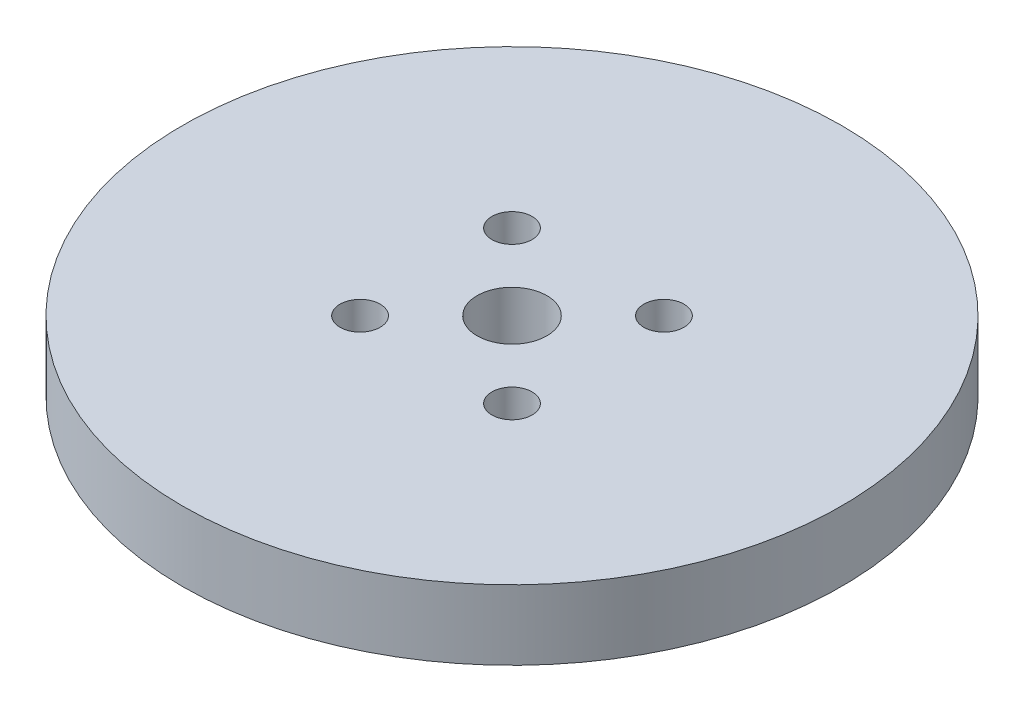
ISO-10303-21;
HEADER;
FILE_DESCRIPTION(('STEP AP214'),'2;1');
FILE_NAME('part.step','',(''),(''),'','','');
FILE_SCHEMA(('AUTOMOTIVE_DESIGN { 1 0 10303 214 1 1 1 1 }'));
ENDSEC;
DATA;
#1=APPLICATION_CONTEXT('core data for automotive mechanical design processes');
#2=APPLICATION_PROTOCOL_DEFINITION('international standard','automotive_design',2000,#1);
#3=PRODUCT_CONTEXT('',#1,'mechanical');
#4=PRODUCT('Part','Part','',(#3));
#5=PRODUCT_RELATED_PRODUCT_CATEGORY('part','',(#4));
#6=PRODUCT_DEFINITION_FORMATION('','',#4);
#7=PRODUCT_DEFINITION_CONTEXT('part definition',#1,'design');
#8=PRODUCT_DEFINITION('design','',#6,#7);
#9=PRODUCT_DEFINITION_SHAPE('','',#8);
#10=(LENGTH_UNIT() NAMED_UNIT(*) SI_UNIT(.MILLI.,.METRE.));
#11=(NAMED_UNIT(*) PLANE_ANGLE_UNIT() SI_UNIT($,.RADIAN.));
#12=(NAMED_UNIT(*) SI_UNIT($,.STERADIAN.) SOLID_ANGLE_UNIT());
#13=UNCERTAINTY_MEASURE_WITH_UNIT(LENGTH_MEASURE(1.E-05),#10,'distance_accuracy_value','');
#14=(GEOMETRIC_REPRESENTATION_CONTEXT(3) GLOBAL_UNCERTAINTY_ASSIGNED_CONTEXT((#13)) GLOBAL_UNIT_ASSIGNED_CONTEXT((#10,
#11,#12)) REPRESENTATION_CONTEXT('',''));
#15=CARTESIAN_POINT('',(0.,0.,0.));
#16=DIRECTION('',(0.,0.,1.));
#17=DIRECTION('',(1.,0.,0.));
#18=AXIS2_PLACEMENT_3D('',#15,#16,#17);
#19=CARTESIAN_POINT('',(0.,6.35,0.));
#20=DIRECTION('',(0.,-1.,0.));
#21=DIRECTION('',(0.,0.,-1.));
#22=AXIS2_PLACEMENT_3D('',#19,#20,#21);
#23=CYLINDRICAL_SURFACE('',#22,30.);
#24=CARTESIAN_POINT('',(0.,6.35,0.));
#25=DIRECTION('',(0.,1.,0.));
#26=DIRECTION('',(0.,0.,1.));
#27=AXIS2_PLACEMENT_3D('',#24,#25,#26);
#28=CIRCLE('',#27,30.);
#29=CARTESIAN_POINT('',(0.,6.35,30.));
#30=VERTEX_POINT('',#29);
#31=EDGE_CURVE('E12',#30,#30,#28,.T.);
#32=ORIENTED_EDGE('',*,*,#31,.F.);
#33=EDGE_LOOP('',(#32));
#34=FACE_BOUND('',#33,.T.);
#35=CARTESIAN_POINT('',(0.,0.,0.));
#36=DIRECTION('',(0.,1.,0.));
#37=DIRECTION('',(0.,0.,1.));
#38=AXIS2_PLACEMENT_3D('',#35,#36,#37);
#39=CIRCLE('',#38,30.);
#40=CARTESIAN_POINT('',(0.,0.,30.));
#41=VERTEX_POINT('',#40);
#42=EDGE_CURVE('E46',#41,#41,#39,.T.);
#43=ORIENTED_EDGE('',*,*,#42,.T.);
#44=EDGE_LOOP('',(#43));
#45=FACE_BOUND('',#44,.T.);
#46=ADVANCED_FACE('F43',(#34,#45),#23,.T.);
#47=CARTESIAN_POINT('',(0.,6.35,0.));
#48=DIRECTION('',(0.,1.,0.));
#49=DIRECTION('',(0.,0.,1.));
#50=AXIS2_PLACEMENT_3D('',#47,#48,#49);
#51=PLANE('',#50);
#52=CARTESIAN_POINT('',(6.91479721322342,6.35,6.914797213223));
#53=DIRECTION('',(0.,1.,0.));
#54=DIRECTION('',(1.,0.,0.));
#55=AXIS2_PLACEMENT_3D('',#52,#53,#54);
#56=CIRCLE('',#55,1.8288);
#57=CARTESIAN_POINT('',(8.74359721322342,6.35,6.914797213223));
#58=VERTEX_POINT('',#57);
#59=EDGE_CURVE('E77',#58,#58,#56,.T.);
#60=ORIENTED_EDGE('',*,*,#59,.F.);
#61=EDGE_LOOP('',(#60));
#62=FACE_BOUND('',#61,.T.);
#63=CARTESIAN_POINT('',(6.91479721322303,6.35,-6.9147972132234));
#64=DIRECTION('',(0.,1.,0.));
#65=DIRECTION('',(0.,0.,-1.));
#66=AXIS2_PLACEMENT_3D('',#63,#64,#65);
#67=CIRCLE('',#66,1.8288);
#68=CARTESIAN_POINT('',(6.91479721322303,6.35,-8.7435972132234));
#69=VERTEX_POINT('',#68);
#70=EDGE_CURVE('E70',#69,#69,#67,.T.);
#71=ORIENTED_EDGE('',*,*,#70,.F.);
#72=EDGE_LOOP('',(#71));
#73=FACE_BOUND('',#72,.T.);
#74=CARTESIAN_POINT('',(-6.91479721322347,6.35,-6.91479721322295));
#75=DIRECTION('',(0.,1.,0.));
#76=DIRECTION('',(-1.,0.,0.));
#77=AXIS2_PLACEMENT_3D('',#74,#75,#76);
#78=CIRCLE('',#77,1.8288);
#79=CARTESIAN_POINT('',(-8.74359721322347,6.35,-6.91479721322294));
#80=VERTEX_POINT('',#79);
#81=EDGE_CURVE('E71',#80,#80,#78,.T.);
#82=ORIENTED_EDGE('',*,*,#81,.F.);
#83=EDGE_LOOP('',(#82));
#84=FACE_BOUND('',#83,.T.);
#85=CARTESIAN_POINT('',(-6.91479721322303,6.35,6.9147972132234));
#86=DIRECTION('',(0.,1.,0.));
#87=DIRECTION('',(0.,0.,1.));
#88=AXIS2_PLACEMENT_3D('',#85,#86,#87);
#89=CIRCLE('',#88,1.8288);
#90=CARTESIAN_POINT('',(-6.91479721322303,6.35,8.7435972132234));
#91=VERTEX_POINT('',#90);
#92=EDGE_CURVE('E63',#91,#91,#89,.T.);
#93=ORIENTED_EDGE('',*,*,#92,.F.);
#94=EDGE_LOOP('',(#93));
#95=FACE_BOUND('',#94,.T.);
#96=CARTESIAN_POINT('',(0.,6.35,0.));
#97=DIRECTION('',(0.,1.,0.));
#98=DIRECTION('',(0.,0.,1.));
#99=AXIS2_PLACEMENT_3D('',#96,#97,#98);
#100=CIRCLE('',#99,3.175);
#101=CARTESIAN_POINT('',(0.,6.35,3.175));
#102=VERTEX_POINT('',#101);
#103=EDGE_CURVE('E57',#102,#102,#100,.T.);
#104=ORIENTED_EDGE('',*,*,#103,.F.);
#105=EDGE_LOOP('',(#104));
#106=FACE_BOUND('',#105,.T.);
#107=ORIENTED_EDGE('',*,*,#31,.T.);
#108=EDGE_LOOP('',(#107));
#109=FACE_BOUND('',#108,.T.);
#110=ADVANCED_FACE('F87',(#62,#73,#84,#95,#106,#109),#51,.T.);
#111=CARTESIAN_POINT('',(0.,0.,0.));
#112=DIRECTION('',(0.,1.,0.));
#113=DIRECTION('',(0.,0.,1.));
#114=AXIS2_PLACEMENT_3D('',#111,#112,#113);
#115=PLANE('',#114);
#116=CARTESIAN_POINT('',(6.91479721322342,0.,6.914797213223));
#117=DIRECTION('',(0.,1.,0.));
#118=DIRECTION('',(0.,0.,1.));
#119=AXIS2_PLACEMENT_3D('',#116,#117,#118);
#120=CIRCLE('',#119,1.8288);
#121=CARTESIAN_POINT('',(6.91479721322342,0.,8.743597213223));
#122=VERTEX_POINT('',#121);
#123=EDGE_CURVE('E66',#122,#122,#120,.F.);
#124=ORIENTED_EDGE('',*,*,#123,.F.);
#125=EDGE_LOOP('',(#124));
#126=FACE_BOUND('',#125,.T.);
#127=CARTESIAN_POINT('',(6.91479721322303,0.,-6.9147972132234));
#128=DIRECTION('',(0.,1.,0.));
#129=DIRECTION('',(0.,0.,1.));
#130=AXIS2_PLACEMENT_3D('',#127,#128,#129);
#131=CIRCLE('',#130,1.8288);
#132=CARTESIAN_POINT('',(6.91479721322303,0.,-5.0859972132234));
#133=VERTEX_POINT('',#132);
#134=EDGE_CURVE('E74',#133,#133,#131,.F.);
#135=ORIENTED_EDGE('',*,*,#134,.F.);
#136=EDGE_LOOP('',(#135));
#137=FACE_BOUND('',#136,.T.);
#138=CARTESIAN_POINT('',(-6.91479721322347,0.,-6.91479721322295));
#139=DIRECTION('',(0.,1.,0.));
#140=DIRECTION('',(0.,0.,1.));
#141=AXIS2_PLACEMENT_3D('',#138,#139,#140);
#142=CIRCLE('',#141,1.8288);
#143=CARTESIAN_POINT('',(-6.91479721322347,0.,-5.08599721322295));
#144=VERTEX_POINT('',#143);
#145=EDGE_CURVE('E67',#144,#144,#142,.F.);
#146=ORIENTED_EDGE('',*,*,#145,.F.);
#147=EDGE_LOOP('',(#146));
#148=FACE_BOUND('',#147,.T.);
#149=CARTESIAN_POINT('',(-6.91479721322303,0.,6.9147972132234));
#150=DIRECTION('',(0.,1.,0.));
#151=DIRECTION('',(0.,0.,1.));
#152=AXIS2_PLACEMENT_3D('',#149,#150,#151);
#153=CIRCLE('',#152,1.8288);
#154=CARTESIAN_POINT('',(-6.91479721322303,0.,8.7435972132234));
#155=VERTEX_POINT('',#154);
#156=EDGE_CURVE('E60',#155,#155,#153,.F.);
#157=ORIENTED_EDGE('',*,*,#156,.F.);
#158=EDGE_LOOP('',(#157));
#159=FACE_BOUND('',#158,.T.);
#160=CARTESIAN_POINT('',(0.,0.,0.));
#161=DIRECTION('',(0.,1.,0.));
#162=DIRECTION('',(0.,0.,1.));
#163=AXIS2_PLACEMENT_3D('',#160,#161,#162);
#164=CIRCLE('',#163,3.175);
#165=CARTESIAN_POINT('',(0.,0.,3.175));
#166=VERTEX_POINT('',#165);
#167=EDGE_CURVE('E53',#166,#166,#164,.F.);
#168=ORIENTED_EDGE('',*,*,#167,.F.);
#169=EDGE_LOOP('',(#168));
#170=FACE_BOUND('',#169,.T.);
#171=ORIENTED_EDGE('',*,*,#42,.F.);
#172=EDGE_LOOP('',(#171));
#173=FACE_BOUND('',#172,.T.);
#174=ADVANCED_FACE('F90',(#126,#137,#148,#159,#170,#173),#115,.F.);
#175=CARTESIAN_POINT('',(0.,-0.00100000000000013,0.));
#176=DIRECTION('',(0.,1.,0.));
#177=DIRECTION('',(0.,0.,1.));
#178=AXIS2_PLACEMENT_3D('',#175,#176,#177);
#179=CYLINDRICAL_SURFACE('',#178,3.175);
#180=ORIENTED_EDGE('',*,*,#103,.T.);
#181=EDGE_LOOP('',(#180));
#182=FACE_BOUND('',#181,.T.);
#183=ORIENTED_EDGE('',*,*,#167,.T.);
#184=EDGE_LOOP('',(#183));
#185=FACE_BOUND('',#184,.T.);
#186=ADVANCED_FACE('F100',(#182,#185),#179,.F.);
#187=CARTESIAN_POINT('',(-6.91479721322303,-5.17262752573583,6.9147972132234));
#188=DIRECTION('',(0.,1.,0.));
#189=DIRECTION('',(0.,0.,1.));
#190=AXIS2_PLACEMENT_3D('',#187,#188,#189);
#191=CYLINDRICAL_SURFACE('',#190,1.8288);
#192=ORIENTED_EDGE('',*,*,#156,.T.);
#193=EDGE_LOOP('',(#192));
#194=FACE_BOUND('',#193,.T.);
#195=ORIENTED_EDGE('',*,*,#92,.T.);
#196=EDGE_LOOP('',(#195));
#197=FACE_BOUND('',#196,.T.);
#198=ADVANCED_FACE('F103',(#194,#197),#191,.F.);
#199=CARTESIAN_POINT('',(-6.91479721322347,-5.17262752573583,-6.91479721322295));
#200=DIRECTION('',(0.,1.,0.));
#201=DIRECTION('',(0.,0.,1.));
#202=AXIS2_PLACEMENT_3D('',#199,#200,#201);
#203=CYLINDRICAL_SURFACE('',#202,1.8288);
#204=ORIENTED_EDGE('',*,*,#145,.T.);
#205=EDGE_LOOP('',(#204));
#206=FACE_BOUND('',#205,.T.);
#207=ORIENTED_EDGE('',*,*,#81,.T.);
#208=EDGE_LOOP('',(#207));
#209=FACE_BOUND('',#208,.T.);
#210=ADVANCED_FACE('F139',(#206,#209),#203,.F.);
#211=CARTESIAN_POINT('',(6.91479721322303,-5.17262752573583,-6.9147972132234));
#212=DIRECTION('',(0.,1.,0.));
#213=DIRECTION('',(0.,0.,1.));
#214=AXIS2_PLACEMENT_3D('',#211,#212,#213);
#215=CYLINDRICAL_SURFACE('',#214,1.8288);
#216=ORIENTED_EDGE('',*,*,#134,.T.);
#217=EDGE_LOOP('',(#216));
#218=FACE_BOUND('',#217,.T.);
#219=ORIENTED_EDGE('',*,*,#70,.T.);
#220=EDGE_LOOP('',(#219));
#221=FACE_BOUND('',#220,.T.);
#222=ADVANCED_FACE('F146',(#218,#221),#215,.F.);
#223=CARTESIAN_POINT('',(6.91479721322342,-5.17262752573583,6.914797213223));
#224=DIRECTION('',(0.,1.,0.));
#225=DIRECTION('',(0.,0.,1.));
#226=AXIS2_PLACEMENT_3D('',#223,#224,#225);
#227=CYLINDRICAL_SURFACE('',#226,1.8288);
#228=ORIENTED_EDGE('',*,*,#123,.T.);
#229=EDGE_LOOP('',(#228));
#230=FACE_BOUND('',#229,.T.);
#231=ORIENTED_EDGE('',*,*,#59,.T.);
#232=EDGE_LOOP('',(#231));
#233=FACE_BOUND('',#232,.T.);
#234=ADVANCED_FACE('F85',(#230,#233),#227,.F.);
#235=CLOSED_SHELL('',(#46,#110,#174,#186,#198,#210,#222,#234));
#236=MANIFOLD_SOLID_BREP('B2',#235);
#237=ADVANCED_BREP_SHAPE_REPRESENTATION('',(#18,#236),#14);
#238=SHAPE_DEFINITION_REPRESENTATION(#9,#237);
ENDSEC;
END-ISO-10303-21;
